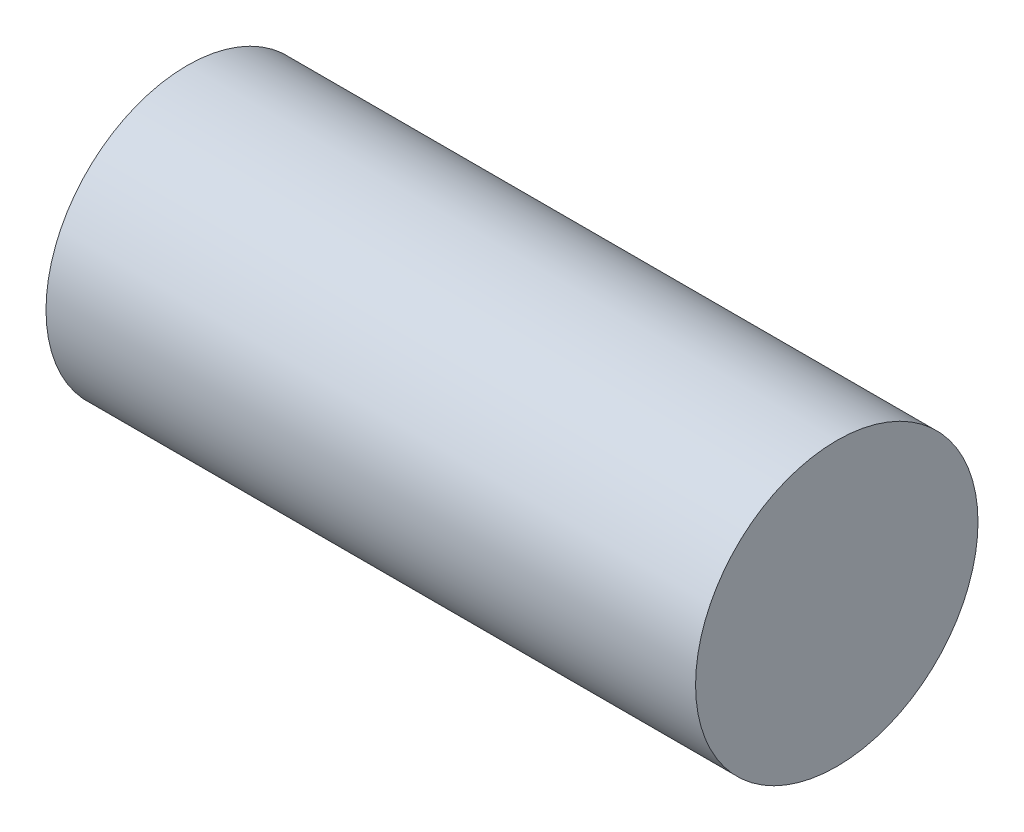
ISO-10303-21;
HEADER;
FILE_DESCRIPTION(('STEP AP214'),'2;1');
FILE_NAME('part.step','',(''),(''),'','','');
FILE_SCHEMA(('AUTOMOTIVE_DESIGN { 1 0 10303 214 1 1 1 1 }'));
ENDSEC;
DATA;
#1=APPLICATION_CONTEXT('core data for automotive mechanical design processes');
#2=APPLICATION_PROTOCOL_DEFINITION('international standard','automotive_design',2000,#1);
#3=PRODUCT_CONTEXT('',#1,'mechanical');
#4=PRODUCT('Part','Part','',(#3));
#5=PRODUCT_RELATED_PRODUCT_CATEGORY('part','',(#4));
#6=PRODUCT_DEFINITION_FORMATION('','',#4);
#7=PRODUCT_DEFINITION_CONTEXT('part definition',#1,'design');
#8=PRODUCT_DEFINITION('design','',#6,#7);
#9=PRODUCT_DEFINITION_SHAPE('','',#8);
#10=(LENGTH_UNIT() NAMED_UNIT(*) SI_UNIT(.MILLI.,.METRE.));
#11=(NAMED_UNIT(*) PLANE_ANGLE_UNIT() SI_UNIT($,.RADIAN.));
#12=(NAMED_UNIT(*) SI_UNIT($,.STERADIAN.) SOLID_ANGLE_UNIT());
#13=UNCERTAINTY_MEASURE_WITH_UNIT(LENGTH_MEASURE(1.E-05),#10,'distance_accuracy_value','');
#14=(GEOMETRIC_REPRESENTATION_CONTEXT(3) GLOBAL_UNCERTAINTY_ASSIGNED_CONTEXT((#13)) GLOBAL_UNIT_ASSIGNED_CONTEXT((#10,
#11,#12)) REPRESENTATION_CONTEXT('',''));
#15=CARTESIAN_POINT('',(0.,0.,0.));
#16=DIRECTION('',(0.,0.,1.));
#17=DIRECTION('',(1.,0.,0.));
#18=AXIS2_PLACEMENT_3D('',#15,#16,#17);
#19=CARTESIAN_POINT('',(-23.,10.,0.));
#20=DIRECTION('',(1.,0.,0.));
#21=DIRECTION('',(0.,1.,0.));
#22=AXIS2_PLACEMENT_3D('',#19,#20,#21);
#23=PLANE('',#22);
#24=CARTESIAN_POINT('',(-23.,0.,0.));
#25=DIRECTION('',(-1.,0.,0.));
#26=DIRECTION('',(0.,-1.,0.));
#27=AXIS2_PLACEMENT_3D('',#24,#25,#26);
#28=CIRCLE('',#27,10.);
#29=CARTESIAN_POINT('',(-23.,-10.,0.));
#30=VERTEX_POINT('',#29);
#31=EDGE_CURVE('E37',#30,#30,#28,.T.);
#32=ORIENTED_EDGE('',*,*,#31,.T.);
#33=EDGE_LOOP('',(#32));
#34=FACE_BOUND('',#33,.T.);
#35=ADVANCED_FACE('F31',(#34),#23,.F.);
#36=CARTESIAN_POINT('',(23.,10.,0.));
#37=DIRECTION('',(-1.,0.,0.));
#38=DIRECTION('',(0.,-1.,0.));
#39=AXIS2_PLACEMENT_3D('',#36,#37,#38);
#40=PLANE('',#39);
#41=CARTESIAN_POINT('',(23.,0.,0.));
#42=DIRECTION('',(-1.,0.,0.));
#43=DIRECTION('',(0.,-1.,0.));
#44=AXIS2_PLACEMENT_3D('',#41,#42,#43);
#45=CIRCLE('',#44,9.99999999999999);
#46=CARTESIAN_POINT('',(23.,-9.99999999999998,0.));
#47=VERTEX_POINT('',#46);
#48=EDGE_CURVE('E10',#47,#47,#45,.T.);
#49=ORIENTED_EDGE('',*,*,#48,.F.);
#50=EDGE_LOOP('',(#49));
#51=FACE_BOUND('',#50,.T.);
#52=ADVANCED_FACE('F46',(#51),#40,.F.);
#53=CARTESIAN_POINT('',(-30.1056910569106,0.,0.));
#54=DIRECTION('',(-1.,0.,0.));
#55=DIRECTION('',(0.,-1.,0.));
#56=AXIS2_PLACEMENT_3D('',#53,#54,#55);
#57=CYLINDRICAL_SURFACE('',#56,10.);
#58=ORIENTED_EDGE('',*,*,#31,.F.);
#59=EDGE_LOOP('',(#58));
#60=FACE_BOUND('',#59,.T.);
#61=ORIENTED_EDGE('',*,*,#48,.T.);
#62=EDGE_LOOP('',(#61));
#63=FACE_BOUND('',#62,.T.);
#64=ADVANCED_FACE('F44',(#60,#63),#57,.T.);
#65=CLOSED_SHELL('',(#35,#52,#64));
#66=MANIFOLD_SOLID_BREP('B2',#65);
#67=ADVANCED_BREP_SHAPE_REPRESENTATION('',(#18,#66),#14);
#68=SHAPE_DEFINITION_REPRESENTATION(#9,#67);
ENDSEC;
END-ISO-10303-21;
